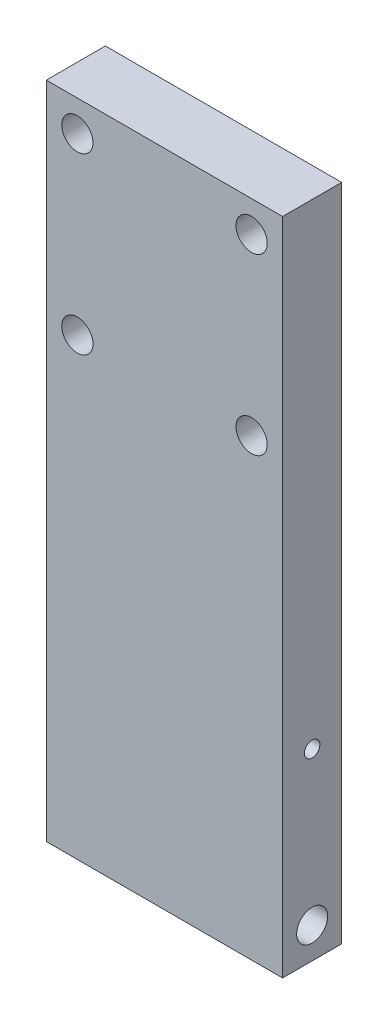
ISO-10303-21;
HEADER;
FILE_DESCRIPTION(('STEP AP214'),'2;1');
FILE_NAME('part.step','',(''),(''),'','','');
FILE_SCHEMA(('AUTOMOTIVE_DESIGN { 1 0 10303 214 1 1 1 1 }'));
ENDSEC;
DATA;
#1=APPLICATION_CONTEXT('core data for automotive mechanical design processes');
#2=APPLICATION_PROTOCOL_DEFINITION('international standard','automotive_design',2000,#1);
#3=PRODUCT_CONTEXT('',#1,'mechanical');
#4=PRODUCT('Part','Part','',(#3));
#5=PRODUCT_RELATED_PRODUCT_CATEGORY('part','',(#4));
#6=PRODUCT_DEFINITION_FORMATION('','',#4);
#7=PRODUCT_DEFINITION_CONTEXT('part definition',#1,'design');
#8=PRODUCT_DEFINITION('design','',#6,#7);
#9=PRODUCT_DEFINITION_SHAPE('','',#8);
#10=(LENGTH_UNIT() NAMED_UNIT(*) SI_UNIT(.MILLI.,.METRE.));
#11=(NAMED_UNIT(*) PLANE_ANGLE_UNIT() SI_UNIT($,.RADIAN.));
#12=(NAMED_UNIT(*) SI_UNIT($,.STERADIAN.) SOLID_ANGLE_UNIT());
#13=UNCERTAINTY_MEASURE_WITH_UNIT(LENGTH_MEASURE(1.E-05),#10,'distance_accuracy_value','');
#14=(GEOMETRIC_REPRESENTATION_CONTEXT(3) GLOBAL_UNCERTAINTY_ASSIGNED_CONTEXT((#13)) GLOBAL_UNIT_ASSIGNED_CONTEXT((#10,
#11,#12)) REPRESENTATION_CONTEXT('',''));
#15=CARTESIAN_POINT('',(0.,0.,0.));
#16=DIRECTION('',(0.,0.,1.));
#17=DIRECTION('',(1.,0.,0.));
#18=AXIS2_PLACEMENT_3D('',#15,#16,#17);
#19=CARTESIAN_POINT('',(-38.1,106.35,9.525));
#20=DIRECTION('',(1.,0.,0.));
#21=DIRECTION('',(0.,1.,0.));
#22=AXIS2_PLACEMENT_3D('',#19,#20,#21);
#23=PLANE('',#22);
#24=CARTESIAN_POINT('',(-38.1,-96.35,0.));
#25=DIRECTION('',(1.,0.,0.));
#26=DIRECTION('',(0.,0.,-1.));
#27=AXIS2_PLACEMENT_3D('',#24,#25,#26);
#28=CIRCLE('',#27,4.99999999999998);
#29=CARTESIAN_POINT('',(-38.1,-96.35,-4.99999999999998));
#30=VERTEX_POINT('',#29);
#31=EDGE_CURVE('E102',#30,#30,#28,.T.);
#32=ORIENTED_EDGE('',*,*,#31,.T.);
#33=EDGE_LOOP('',(#32));
#34=FACE_BOUND('',#33,.T.);
#35=DIRECTION('',(0.,-1.,0.));
#36=VECTOR('',#35,1.);
#37=CARTESIAN_POINT('',(-38.1,106.35,-9.525));
#38=LINE('',#37,#36);
#39=CARTESIAN_POINT('',(-38.1,106.35,-9.525));
#40=VERTEX_POINT('',#39);
#41=CARTESIAN_POINT('',(-38.1,-106.35,-9.525));
#42=VERTEX_POINT('',#41);
#43=EDGE_CURVE('E111',#40,#42,#38,.T.);
#44=ORIENTED_EDGE('',*,*,#43,.T.);
#45=DIRECTION('',(0.,0.,-1.));
#46=VECTOR('',#45,1.);
#47=CARTESIAN_POINT('',(-38.1,-106.35,9.525));
#48=LINE('',#47,#46);
#49=CARTESIAN_POINT('',(-38.1,-106.35,9.525));
#50=VERTEX_POINT('',#49);
#51=EDGE_CURVE('E11',#50,#42,#48,.T.);
#52=ORIENTED_EDGE('',*,*,#51,.F.);
#53=DIRECTION('',(0.,-1.,0.));
#54=VECTOR('',#53,1.);
#55=CARTESIAN_POINT('',(-38.1,106.35,9.525));
#56=LINE('',#55,#54);
#57=CARTESIAN_POINT('',(-38.1,106.35,9.525));
#58=VERTEX_POINT('',#57);
#59=EDGE_CURVE('E112',#58,#50,#56,.T.);
#60=ORIENTED_EDGE('',*,*,#59,.F.);
#61=DIRECTION('',(0.,0.,-1.));
#62=VECTOR('',#61,1.);
#63=CARTESIAN_POINT('',(-38.1,106.35,9.525));
#64=LINE('',#63,#62);
#65=EDGE_CURVE('E118',#58,#40,#64,.T.);
#66=ORIENTED_EDGE('',*,*,#65,.T.);
#67=EDGE_LOOP('',(#44,#52,#60,#66));
#68=FACE_BOUND('',#67,.T.);
#69=ADVANCED_FACE('F37',(#34,#68),#23,.F.);
#70=CARTESIAN_POINT('',(38.1,-106.35,9.525));
#71=DIRECTION('',(0.,1.,0.));
#72=DIRECTION('',(0.,0.,1.));
#73=AXIS2_PLACEMENT_3D('',#70,#71,#72);
#74=PLANE('',#73);
#75=DIRECTION('',(1.,0.,0.));
#76=VECTOR('',#75,1.);
#77=CARTESIAN_POINT('',(38.1,-106.35,-9.525));
#78=LINE('',#77,#76);
#79=CARTESIAN_POINT('',(38.1,-106.35,-9.525));
#80=VERTEX_POINT('',#79);
#81=EDGE_CURVE('E121',#42,#80,#78,.T.);
#82=ORIENTED_EDGE('',*,*,#81,.T.);
#83=DIRECTION('',(0.,0.,-1.));
#84=VECTOR('',#83,1.);
#85=CARTESIAN_POINT('',(38.1,-106.35,9.525));
#86=LINE('',#85,#84);
#87=CARTESIAN_POINT('',(38.1,-106.35,9.525));
#88=VERTEX_POINT('',#87);
#89=EDGE_CURVE('E45',#88,#80,#86,.T.);
#90=ORIENTED_EDGE('',*,*,#89,.F.);
#91=DIRECTION('',(1.,0.,0.));
#92=VECTOR('',#91,1.);
#93=CARTESIAN_POINT('',(38.1,-106.35,9.525));
#94=LINE('',#93,#92);
#95=EDGE_CURVE('E84',#50,#88,#94,.T.);
#96=ORIENTED_EDGE('',*,*,#95,.F.);
#97=ORIENTED_EDGE('',*,*,#51,.T.);
#98=EDGE_LOOP('',(#82,#90,#96,#97));
#99=FACE_BOUND('',#98,.T.);
#100=ADVANCED_FACE('F145',(#99),#74,.F.);
#101=CARTESIAN_POINT('',(38.1,106.35,9.525));
#102=DIRECTION('',(-1.,0.,0.));
#103=DIRECTION('',(0.,-1.,0.));
#104=AXIS2_PLACEMENT_3D('',#101,#102,#103);
#105=PLANE('',#104);
#106=CARTESIAN_POINT('',(38.1,-47.1499999999982,-2.3850140612458E-11));
#107=DIRECTION('',(1.,0.,0.));
#108=DIRECTION('',(0.,0.,-1.));
#109=AXIS2_PLACEMENT_3D('',#106,#107,#108);
#110=CIRCLE('',#109,2.49999999999999);
#111=CARTESIAN_POINT('',(38.1,-47.1499999999982,-2.50000000002384));
#112=VERTEX_POINT('',#111);
#113=EDGE_CURVE('E99',#112,#112,#110,.T.);
#114=ORIENTED_EDGE('',*,*,#113,.F.);
#115=EDGE_LOOP('',(#114));
#116=FACE_BOUND('',#115,.T.);
#117=CARTESIAN_POINT('',(38.1,-96.35,0.));
#118=DIRECTION('',(1.,0.,0.));
#119=DIRECTION('',(0.,0.,-1.));
#120=AXIS2_PLACEMENT_3D('',#117,#118,#119);
#121=CIRCLE('',#120,4.99999999999999);
#122=CARTESIAN_POINT('',(38.1,-96.35,-4.99999999999999));
#123=VERTEX_POINT('',#122);
#124=EDGE_CURVE('E98',#123,#123,#121,.T.);
#125=ORIENTED_EDGE('',*,*,#124,.F.);
#126=EDGE_LOOP('',(#125));
#127=FACE_BOUND('',#126,.T.);
#128=DIRECTION('',(0.,1.,0.));
#129=VECTOR('',#128,1.);
#130=CARTESIAN_POINT('',(38.1,106.35,-9.525));
#131=LINE('',#130,#129);
#132=CARTESIAN_POINT('',(38.1,106.35,-9.525));
#133=VERTEX_POINT('',#132);
#134=EDGE_CURVE('E71',#80,#133,#131,.T.);
#135=ORIENTED_EDGE('',*,*,#134,.T.);
#136=DIRECTION('',(0.,0.,-1.));
#137=VECTOR('',#136,1.);
#138=CARTESIAN_POINT('',(38.1,106.35,9.525));
#139=LINE('',#138,#137);
#140=CARTESIAN_POINT('',(38.1,106.35,9.525));
#141=VERTEX_POINT('',#140);
#142=EDGE_CURVE('E126',#141,#133,#139,.T.);
#143=ORIENTED_EDGE('',*,*,#142,.F.);
#144=DIRECTION('',(0.,1.,0.));
#145=VECTOR('',#144,1.);
#146=CARTESIAN_POINT('',(38.1,106.35,9.525));
#147=LINE('',#146,#145);
#148=EDGE_CURVE('E115',#88,#141,#147,.T.);
#149=ORIENTED_EDGE('',*,*,#148,.F.);
#150=ORIENTED_EDGE('',*,*,#89,.T.);
#151=EDGE_LOOP('',(#135,#143,#149,#150));
#152=FACE_BOUND('',#151,.T.);
#153=ADVANCED_FACE('F128',(#116,#127,#152),#105,.F.);
#154=CARTESIAN_POINT('',(38.1,106.35,9.525));
#155=DIRECTION('',(0.,-1.,0.));
#156=DIRECTION('',(0.,0.,-1.));
#157=AXIS2_PLACEMENT_3D('',#154,#155,#156);
#158=PLANE('',#157);
#159=DIRECTION('',(-1.,0.,0.));
#160=VECTOR('',#159,1.);
#161=CARTESIAN_POINT('',(38.1,106.35,-9.525));
#162=LINE('',#161,#160);
#163=EDGE_CURVE('E77',#133,#40,#162,.T.);
#164=ORIENTED_EDGE('',*,*,#163,.T.);
#165=ORIENTED_EDGE('',*,*,#65,.F.);
#166=DIRECTION('',(-1.,0.,0.));
#167=VECTOR('',#166,1.);
#168=CARTESIAN_POINT('',(38.1,106.35,9.525));
#169=LINE('',#168,#167);
#170=EDGE_CURVE('E53',#141,#58,#169,.T.);
#171=ORIENTED_EDGE('',*,*,#170,.F.);
#172=ORIENTED_EDGE('',*,*,#142,.T.);
#173=EDGE_LOOP('',(#164,#165,#171,#172));
#174=FACE_BOUND('',#173,.T.);
#175=ADVANCED_FACE('F135',(#174),#158,.F.);
#176=CARTESIAN_POINT('',(0.,0.,9.525));
#177=DIRECTION('',(0.,0.,-1.));
#178=DIRECTION('',(-1.,0.,0.));
#179=AXIS2_PLACEMENT_3D('',#176,#177,#178);
#180=PLANE('',#179);
#181=CARTESIAN_POINT('',(28.1,96.35,9.525));
#182=DIRECTION('',(0.,0.,-1.));
#183=DIRECTION('',(-1.,0.,0.));
#184=AXIS2_PLACEMENT_3D('',#181,#182,#183);
#185=CIRCLE('',#184,5.04189999999999);
#186=CARTESIAN_POINT('',(23.0581,96.35,9.525));
#187=VERTEX_POINT('',#186);
#188=EDGE_CURVE('E188',#187,#187,#185,.T.);
#189=ORIENTED_EDGE('',*,*,#188,.T.);
#190=EDGE_LOOP('',(#189));
#191=FACE_BOUND('',#190,.T.);
#192=CARTESIAN_POINT('',(28.1,40.15,9.525));
#193=DIRECTION('',(0.,0.,-1.));
#194=DIRECTION('',(-1.,0.,0.));
#195=AXIS2_PLACEMENT_3D('',#192,#193,#194);
#196=CIRCLE('',#195,5.04189999999999);
#197=CARTESIAN_POINT('',(23.0581,40.15,9.525));
#198=VERTEX_POINT('',#197);
#199=EDGE_CURVE('E198',#198,#198,#196,.T.);
#200=ORIENTED_EDGE('',*,*,#199,.T.);
#201=EDGE_LOOP('',(#200));
#202=FACE_BOUND('',#201,.T.);
#203=CARTESIAN_POINT('',(-28.1,40.15,9.525));
#204=DIRECTION('',(0.,0.,-1.));
#205=DIRECTION('',(-1.,0.,0.));
#206=AXIS2_PLACEMENT_3D('',#203,#204,#205);
#207=CIRCLE('',#206,5.04189999999999);
#208=CARTESIAN_POINT('',(-33.1419,40.15,9.525));
#209=VERTEX_POINT('',#208);
#210=EDGE_CURVE('E204',#209,#209,#207,.T.);
#211=ORIENTED_EDGE('',*,*,#210,.T.);
#212=EDGE_LOOP('',(#211));
#213=FACE_BOUND('',#212,.T.);
#214=CARTESIAN_POINT('',(-28.1,96.35,9.525));
#215=DIRECTION('',(0.,0.,-1.));
#216=DIRECTION('',(-1.,0.,0.));
#217=AXIS2_PLACEMENT_3D('',#214,#215,#216);
#218=CIRCLE('',#217,5.04189999999999);
#219=CARTESIAN_POINT('',(-33.1419,96.35,9.525));
#220=VERTEX_POINT('',#219);
#221=EDGE_CURVE('E105',#220,#220,#218,.T.);
#222=ORIENTED_EDGE('',*,*,#221,.T.);
#223=EDGE_LOOP('',(#222));
#224=FACE_BOUND('',#223,.T.);
#225=ORIENTED_EDGE('',*,*,#59,.T.);
#226=ORIENTED_EDGE('',*,*,#95,.T.);
#227=ORIENTED_EDGE('',*,*,#148,.T.);
#228=ORIENTED_EDGE('',*,*,#170,.T.);
#229=EDGE_LOOP('',(#225,#226,#227,#228));
#230=FACE_BOUND('',#229,.T.);
#231=ADVANCED_FACE('F137',(#191,#202,#213,#224,#230),#180,.F.);
#232=CARTESIAN_POINT('',(0.,0.,-9.525));
#233=DIRECTION('',(0.,0.,-1.));
#234=DIRECTION('',(-1.,0.,0.));
#235=AXIS2_PLACEMENT_3D('',#232,#233,#234);
#236=PLANE('',#235);
#237=CARTESIAN_POINT('',(28.1,96.35,-9.525));
#238=DIRECTION('',(0.,0.,-1.));
#239=DIRECTION('',(-1.,0.,0.));
#240=AXIS2_PLACEMENT_3D('',#237,#238,#239);
#241=CIRCLE('',#240,5.04189999999999);
#242=CARTESIAN_POINT('',(23.0581,96.35,-9.525));
#243=VERTEX_POINT('',#242);
#244=EDGE_CURVE('E191',#243,#243,#241,.T.);
#245=ORIENTED_EDGE('',*,*,#244,.F.);
#246=EDGE_LOOP('',(#245));
#247=FACE_BOUND('',#246,.T.);
#248=CARTESIAN_POINT('',(28.1,40.15,-9.525));
#249=DIRECTION('',(0.,0.,-1.));
#250=DIRECTION('',(-1.,0.,0.));
#251=AXIS2_PLACEMENT_3D('',#248,#249,#250);
#252=CIRCLE('',#251,5.04189999999999);
#253=CARTESIAN_POINT('',(23.0581,40.15,-9.525));
#254=VERTEX_POINT('',#253);
#255=EDGE_CURVE('E193',#254,#254,#252,.T.);
#256=ORIENTED_EDGE('',*,*,#255,.F.);
#257=EDGE_LOOP('',(#256));
#258=FACE_BOUND('',#257,.T.);
#259=CARTESIAN_POINT('',(-28.1,40.15,-9.525));
#260=DIRECTION('',(0.,0.,-1.));
#261=DIRECTION('',(-1.,0.,0.));
#262=AXIS2_PLACEMENT_3D('',#259,#260,#261);
#263=CIRCLE('',#262,5.04189999999999);
#264=CARTESIAN_POINT('',(-33.1419,40.15,-9.525));
#265=VERTEX_POINT('',#264);
#266=EDGE_CURVE('E201',#265,#265,#263,.T.);
#267=ORIENTED_EDGE('',*,*,#266,.F.);
#268=EDGE_LOOP('',(#267));
#269=FACE_BOUND('',#268,.T.);
#270=CARTESIAN_POINT('',(-28.1,96.35,-9.525));
#271=DIRECTION('',(0.,0.,-1.));
#272=DIRECTION('',(-1.,0.,0.));
#273=AXIS2_PLACEMENT_3D('',#270,#271,#272);
#274=CIRCLE('',#273,5.04189999999999);
#275=CARTESIAN_POINT('',(-33.1419,96.35,-9.525));
#276=VERTEX_POINT('',#275);
#277=EDGE_CURVE('E207',#276,#276,#274,.T.);
#278=ORIENTED_EDGE('',*,*,#277,.F.);
#279=EDGE_LOOP('',(#278));
#280=FACE_BOUND('',#279,.T.);
#281=ORIENTED_EDGE('',*,*,#43,.F.);
#282=ORIENTED_EDGE('',*,*,#163,.F.);
#283=ORIENTED_EDGE('',*,*,#134,.F.);
#284=ORIENTED_EDGE('',*,*,#81,.F.);
#285=EDGE_LOOP('',(#281,#282,#283,#284));
#286=FACE_BOUND('',#285,.T.);
#287=ADVANCED_FACE('F131',(#247,#258,#269,#280,#286),#236,.T.);
#288=CARTESIAN_POINT('',(38.1,-96.35,0.));
#289=DIRECTION('',(1.,0.,0.));
#290=DIRECTION('',(0.,0.,-1.));
#291=AXIS2_PLACEMENT_3D('',#288,#289,#290);
#292=CYLINDRICAL_SURFACE('',#291,4.99999999999998);
#293=ORIENTED_EDGE('',*,*,#31,.F.);
#294=EDGE_LOOP('',(#293));
#295=FACE_BOUND('',#294,.T.);
#296=ORIENTED_EDGE('',*,*,#124,.T.);
#297=EDGE_LOOP('',(#296));
#298=FACE_BOUND('',#297,.T.);
#299=ADVANCED_FACE('F92',(#295,#298),#292,.F.);
#300=CARTESIAN_POINT('',(28.1,-47.1499999999982,-2.3850140612458E-11));
#301=DIRECTION('',(1.,0.,0.));
#302=DIRECTION('',(0.,0.,-1.));
#303=AXIS2_PLACEMENT_3D('',#300,#301,#302);
#304=CONICAL_SURFACE('',#303,2.5,1.02974425867665);
#305=CARTESIAN_POINT('',(26.5978484524311,-47.1499999999982,-2.3850140612458E-11));
#306=VERTEX_POINT('',#305);
#307=VERTEX_LOOP('',#306);
#308=FACE_BOUND('',#307,.T.);
#309=CARTESIAN_POINT('',(28.1,-47.1499999999982,-2.3850140612458E-11));
#310=DIRECTION('',(1.,0.,0.));
#311=DIRECTION('',(0.,0.,-1.));
#312=AXIS2_PLACEMENT_3D('',#309,#310,#311);
#313=CIRCLE('',#312,2.5);
#314=CARTESIAN_POINT('',(28.1,-47.1499999999982,-2.50000000002385));
#315=VERTEX_POINT('',#314);
#316=EDGE_CURVE('E96',#315,#315,#313,.T.);
#317=ORIENTED_EDGE('',*,*,#316,.T.);
#318=EDGE_LOOP('',(#317));
#319=FACE_BOUND('',#318,.T.);
#320=ADVANCED_FACE('F88',(#308,#319),#304,.F.);
#321=CARTESIAN_POINT('',(38.1,-47.1499999999982,-2.3850140612458E-11));
#322=DIRECTION('',(1.,0.,0.));
#323=DIRECTION('',(0.,0.,-1.));
#324=AXIS2_PLACEMENT_3D('',#321,#322,#323);
#325=CYLINDRICAL_SURFACE('',#324,2.49999999999999);
#326=ORIENTED_EDGE('',*,*,#316,.F.);
#327=EDGE_LOOP('',(#326));
#328=FACE_BOUND('',#327,.T.);
#329=ORIENTED_EDGE('',*,*,#113,.T.);
#330=EDGE_LOOP('',(#329));
#331=FACE_BOUND('',#330,.T.);
#332=ADVANCED_FACE('F91',(#328,#331),#325,.F.);
#333=CARTESIAN_POINT('',(-28.1,96.35,-9.525));
#334=DIRECTION('',(0.,0.,-1.));
#335=DIRECTION('',(-1.,0.,0.));
#336=AXIS2_PLACEMENT_3D('',#333,#334,#335);
#337=CYLINDRICAL_SURFACE('',#336,5.04189999999999);
#338=ORIENTED_EDGE('',*,*,#221,.F.);
#339=EDGE_LOOP('',(#338));
#340=FACE_BOUND('',#339,.T.);
#341=ORIENTED_EDGE('',*,*,#277,.T.);
#342=EDGE_LOOP('',(#341));
#343=FACE_BOUND('',#342,.T.);
#344=ADVANCED_FACE('F168',(#340,#343),#337,.F.);
#345=CARTESIAN_POINT('',(-28.1,40.15,-9.525));
#346=DIRECTION('',(0.,0.,-1.));
#347=DIRECTION('',(-1.,0.,0.));
#348=AXIS2_PLACEMENT_3D('',#345,#346,#347);
#349=CYLINDRICAL_SURFACE('',#348,5.04189999999999);
#350=ORIENTED_EDGE('',*,*,#210,.F.);
#351=EDGE_LOOP('',(#350));
#352=FACE_BOUND('',#351,.T.);
#353=ORIENTED_EDGE('',*,*,#266,.T.);
#354=EDGE_LOOP('',(#353));
#355=FACE_BOUND('',#354,.T.);
#356=ADVANCED_FACE('F171',(#352,#355),#349,.F.);
#357=CARTESIAN_POINT('',(28.1,40.15,-9.525));
#358=DIRECTION('',(0.,0.,-1.));
#359=DIRECTION('',(-1.,0.,0.));
#360=AXIS2_PLACEMENT_3D('',#357,#358,#359);
#361=CYLINDRICAL_SURFACE('',#360,5.04189999999999);
#362=ORIENTED_EDGE('',*,*,#199,.F.);
#363=EDGE_LOOP('',(#362));
#364=FACE_BOUND('',#363,.T.);
#365=ORIENTED_EDGE('',*,*,#255,.T.);
#366=EDGE_LOOP('',(#365));
#367=FACE_BOUND('',#366,.T.);
#368=ADVANCED_FACE('F175',(#364,#367),#361,.F.);
#369=CARTESIAN_POINT('',(28.1,96.35,-9.525));
#370=DIRECTION('',(0.,0.,-1.));
#371=DIRECTION('',(-1.,0.,0.));
#372=AXIS2_PLACEMENT_3D('',#369,#370,#371);
#373=CYLINDRICAL_SURFACE('',#372,5.04189999999999);
#374=ORIENTED_EDGE('',*,*,#188,.F.);
#375=EDGE_LOOP('',(#374));
#376=FACE_BOUND('',#375,.T.);
#377=ORIENTED_EDGE('',*,*,#244,.T.);
#378=EDGE_LOOP('',(#377));
#379=FACE_BOUND('',#378,.T.);
#380=ADVANCED_FACE('F179',(#376,#379),#373,.F.);
#381=CLOSED_SHELL('',(#69,#100,#153,#175,#231,#287,#299,#320,#332,#344,#356,#368,#380));
#382=MANIFOLD_SOLID_BREP('B2',#381);
#383=ADVANCED_BREP_SHAPE_REPRESENTATION('',(#18,#382),#14);
#384=SHAPE_DEFINITION_REPRESENTATION(#9,#383);
ENDSEC;
END-ISO-10303-21;
